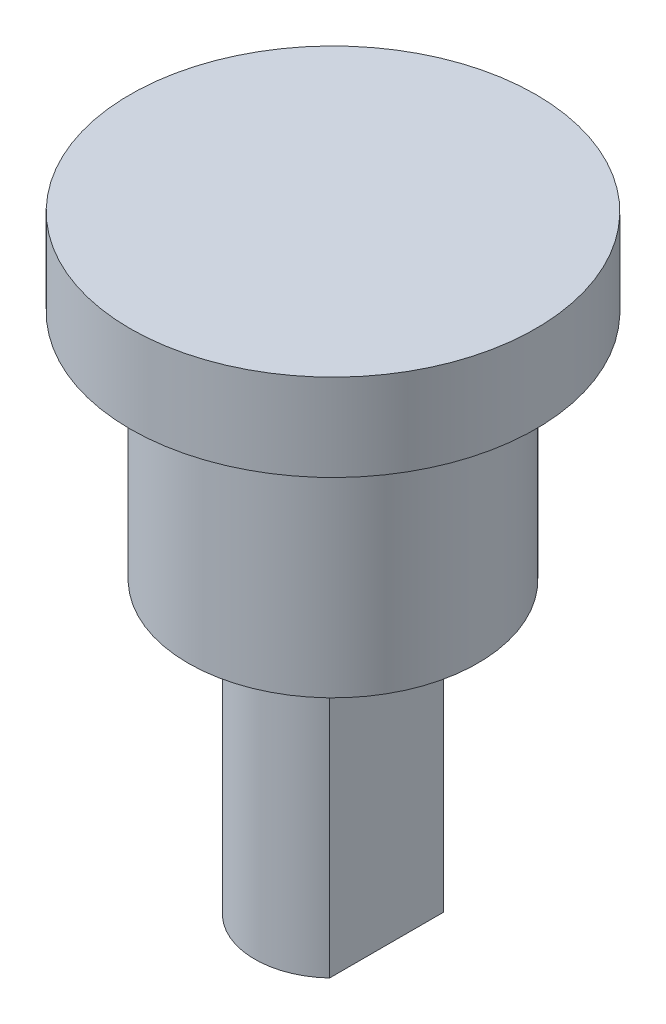
ISO-10303-21;
HEADER;
FILE_DESCRIPTION(('STEP AP214'),'2;1');
FILE_NAME('part.step','',(''),(''),'','','');
FILE_SCHEMA(('AUTOMOTIVE_DESIGN { 1 0 10303 214 1 1 1 1 }'));
ENDSEC;
DATA;
#1=APPLICATION_CONTEXT('core data for automotive mechanical design processes');
#2=APPLICATION_PROTOCOL_DEFINITION('international standard','automotive_design',2000,#1);
#3=PRODUCT_CONTEXT('',#1,'mechanical');
#4=PRODUCT('Part','Part','',(#3));
#5=PRODUCT_RELATED_PRODUCT_CATEGORY('part','',(#4));
#6=PRODUCT_DEFINITION_FORMATION('','',#4);
#7=PRODUCT_DEFINITION_CONTEXT('part definition',#1,'design');
#8=PRODUCT_DEFINITION('design','',#6,#7);
#9=PRODUCT_DEFINITION_SHAPE('','',#8);
#10=(LENGTH_UNIT() NAMED_UNIT(*) SI_UNIT(.MILLI.,.METRE.));
#11=(NAMED_UNIT(*) PLANE_ANGLE_UNIT() SI_UNIT($,.RADIAN.));
#12=(NAMED_UNIT(*) SI_UNIT($,.STERADIAN.) SOLID_ANGLE_UNIT());
#13=UNCERTAINTY_MEASURE_WITH_UNIT(LENGTH_MEASURE(1.E-05),#10,'distance_accuracy_value','');
#14=(GEOMETRIC_REPRESENTATION_CONTEXT(3) GLOBAL_UNCERTAINTY_ASSIGNED_CONTEXT((#13)) GLOBAL_UNIT_ASSIGNED_CONTEXT((#10,
#11,#12)) REPRESENTATION_CONTEXT('',''));
#15=CARTESIAN_POINT('',(0.,0.,0.));
#16=DIRECTION('',(0.,0.,1.));
#17=DIRECTION('',(1.,0.,0.));
#18=AXIS2_PLACEMENT_3D('',#15,#16,#17);
#19=CARTESIAN_POINT('',(0.,3.,0.));
#20=DIRECTION('',(0.,-1.,0.));
#21=DIRECTION('',(0.,0.,-1.));
#22=AXIS2_PLACEMENT_3D('',#19,#20,#21);
#23=CYLINDRICAL_SURFACE('',#22,7.);
#24=CARTESIAN_POINT('',(0.,3.,0.));
#25=DIRECTION('',(0.,1.,0.));
#26=DIRECTION('',(0.,0.,1.));
#27=AXIS2_PLACEMENT_3D('',#24,#25,#26);
#28=CIRCLE('',#27,7.);
#29=CARTESIAN_POINT('',(0.,3.,7.));
#30=VERTEX_POINT('',#29);
#31=EDGE_CURVE('E12',#30,#30,#28,.T.);
#32=ORIENTED_EDGE('',*,*,#31,.F.);
#33=EDGE_LOOP('',(#32));
#34=FACE_BOUND('',#33,.T.);
#35=CARTESIAN_POINT('',(0.,0.,0.));
#36=DIRECTION('',(0.,1.,0.));
#37=DIRECTION('',(0.,0.,1.));
#38=AXIS2_PLACEMENT_3D('',#35,#36,#37);
#39=CIRCLE('',#38,7.);
#40=CARTESIAN_POINT('',(0.,0.,7.));
#41=VERTEX_POINT('',#40);
#42=EDGE_CURVE('E62',#41,#41,#39,.T.);
#43=ORIENTED_EDGE('',*,*,#42,.T.);
#44=EDGE_LOOP('',(#43));
#45=FACE_BOUND('',#44,.T.);
#46=ADVANCED_FACE('F59',(#34,#45),#23,.T.);
#47=CARTESIAN_POINT('',(0.,0.,0.));
#48=DIRECTION('',(0.,1.,0.));
#49=DIRECTION('',(0.,0.,1.));
#50=AXIS2_PLACEMENT_3D('',#47,#48,#49);
#51=PLANE('',#50);
#52=CARTESIAN_POINT('',(0.,0.,0.));
#53=DIRECTION('',(0.,1.,0.));
#54=DIRECTION('',(0.,0.,1.));
#55=AXIS2_PLACEMENT_3D('',#52,#53,#54);
#56=CIRCLE('',#55,5.);
#57=CARTESIAN_POINT('',(0.,0.,5.));
#58=VERTEX_POINT('',#57);
#59=EDGE_CURVE('E144',#58,#58,#56,.T.);
#60=ORIENTED_EDGE('',*,*,#59,.T.);
#61=EDGE_LOOP('',(#60));
#62=FACE_BOUND('',#61,.T.);
#63=ORIENTED_EDGE('',*,*,#42,.F.);
#64=EDGE_LOOP('',(#63));
#65=FACE_BOUND('',#64,.T.);
#66=ADVANCED_FACE('F157',(#62,#65),#51,.F.);
#67=CARTESIAN_POINT('',(0.,3.,0.));
#68=DIRECTION('',(0.,1.,0.));
#69=DIRECTION('',(0.,0.,1.));
#70=AXIS2_PLACEMENT_3D('',#67,#68,#69);
#71=PLANE('',#70);
#72=ORIENTED_EDGE('',*,*,#31,.T.);
#73=EDGE_LOOP('',(#72));
#74=FACE_BOUND('',#73,.T.);
#75=ADVANCED_FACE('F163',(#74),#71,.T.);
#76=CARTESIAN_POINT('',(0.,-8.,0.));
#77=DIRECTION('',(0.,1.,0.));
#78=DIRECTION('',(0.,0.,1.));
#79=AXIS2_PLACEMENT_3D('',#76,#77,#78);
#80=CYLINDRICAL_SURFACE('',#79,5.);
#81=CARTESIAN_POINT('',(0.,-8.,0.));
#82=DIRECTION('',(0.,1.,0.));
#83=DIRECTION('',(0.,0.,1.));
#84=AXIS2_PLACEMENT_3D('',#81,#82,#83);
#85=CIRCLE('',#84,5.);
#86=CARTESIAN_POINT('',(0.,-8.,5.));
#87=VERTEX_POINT('',#86);
#88=EDGE_CURVE('E149',#87,#87,#85,.T.);
#89=ORIENTED_EDGE('',*,*,#88,.T.);
#90=EDGE_LOOP('',(#89));
#91=FACE_BOUND('',#90,.T.);
#92=ORIENTED_EDGE('',*,*,#59,.F.);
#93=EDGE_LOOP('',(#92));
#94=FACE_BOUND('',#93,.T.);
#95=ADVANCED_FACE('F160',(#91,#94),#80,.T.);
#96=CARTESIAN_POINT('',(0.,-8.,0.));
#97=DIRECTION('',(0.,1.,0.));
#98=DIRECTION('',(0.,0.,1.));
#99=AXIS2_PLACEMENT_3D('',#96,#97,#98);
#100=PLANE('',#99);
#101=DIRECTION('',(0.,0.,1.));
#102=VECTOR('',#101,1.);
#103=CARTESIAN_POINT('',(-1.85,-8.,0.));
#104=LINE('',#103,#102);
#105=CARTESIAN_POINT('',(-1.85,-8.,-1.96659604392971));
#106=VERTEX_POINT('',#105);
#107=CARTESIAN_POINT('',(-1.85,-8.,1.96659604392971));
#108=VERTEX_POINT('',#107);
#109=EDGE_CURVE('E138',#106,#108,#104,.T.);
#110=ORIENTED_EDGE('',*,*,#109,.T.);
#111=CARTESIAN_POINT('',(0.,-8.,0.));
#112=DIRECTION('',(0.,1.,0.));
#113=DIRECTION('',(0.,0.,1.));
#114=AXIS2_PLACEMENT_3D('',#111,#112,#113);
#115=CIRCLE('',#114,2.7);
#116=CARTESIAN_POINT('',(1.85,-8.,1.96659604392971));
#117=VERTEX_POINT('',#116);
#118=EDGE_CURVE('E74',#108,#117,#115,.T.);
#119=ORIENTED_EDGE('',*,*,#118,.T.);
#120=DIRECTION('',(0.,0.,1.));
#121=VECTOR('',#120,1.);
#122=CARTESIAN_POINT('',(1.85,-8.,0.));
#123=LINE('',#122,#121);
#124=CARTESIAN_POINT('',(1.85,-8.,-1.96659604392971));
#125=VERTEX_POINT('',#124);
#126=EDGE_CURVE('E133',#125,#117,#123,.T.);
#127=ORIENTED_EDGE('',*,*,#126,.F.);
#128=CARTESIAN_POINT('',(0.,-8.,0.));
#129=DIRECTION('',(0.,1.,0.));
#130=DIRECTION('',(0.,0.,1.));
#131=AXIS2_PLACEMENT_3D('',#128,#129,#130);
#132=CIRCLE('',#131,2.7);
#133=EDGE_CURVE('E111',#125,#106,#132,.T.);
#134=ORIENTED_EDGE('',*,*,#133,.T.);
#135=EDGE_LOOP('',(#110,#119,#127,#134));
#136=FACE_BOUND('',#135,.T.);
#137=ORIENTED_EDGE('',*,*,#88,.F.);
#138=EDGE_LOOP('',(#137));
#139=FACE_BOUND('',#138,.T.);
#140=ADVANCED_FACE('F162',(#136,#139),#100,.F.);
#141=CARTESIAN_POINT('',(0.,-18.,0.));
#142=DIRECTION('',(0.,1.,0.));
#143=DIRECTION('',(0.,0.,1.));
#144=AXIS2_PLACEMENT_3D('',#141,#142,#143);
#145=CYLINDRICAL_SURFACE('',#144,2.7);
#146=ORIENTED_EDGE('',*,*,#118,.F.);
#147=DIRECTION('',(0.,1.,0.));
#148=VECTOR('',#147,1.);
#149=CARTESIAN_POINT('',(-1.85,-18.,1.96659604392971));
#150=LINE('',#149,#148);
#151=CARTESIAN_POINT('',(-1.85,-18.,1.96659604392971));
#152=VERTEX_POINT('',#151);
#153=EDGE_CURVE('E79',#152,#108,#150,.T.);
#154=ORIENTED_EDGE('',*,*,#153,.F.);
#155=CARTESIAN_POINT('',(0.,-18.,0.));
#156=DIRECTION('',(0.,1.,0.));
#157=DIRECTION('',(0.,0.,1.));
#158=AXIS2_PLACEMENT_3D('',#155,#156,#157);
#159=CIRCLE('',#158,2.7);
#160=CARTESIAN_POINT('',(1.85,-18.,1.96659604392971));
#161=VERTEX_POINT('',#160);
#162=EDGE_CURVE('E120',#152,#161,#159,.T.);
#163=ORIENTED_EDGE('',*,*,#162,.T.);
#164=DIRECTION('',(0.,1.,0.));
#165=VECTOR('',#164,1.);
#166=CARTESIAN_POINT('',(1.85,-18.,1.96659604392971));
#167=LINE('',#166,#165);
#168=EDGE_CURVE('E116',#161,#117,#167,.T.);
#169=ORIENTED_EDGE('',*,*,#168,.T.);
#170=EDGE_LOOP('',(#146,#154,#163,#169));
#171=FACE_BOUND('',#170,.T.);
#172=ADVANCED_FACE('F170',(#171),#145,.T.);
#173=CARTESIAN_POINT('',(-1.85,-18.,0.));
#174=DIRECTION('',(-1.,0.,0.));
#175=DIRECTION('',(0.,0.,1.));
#176=AXIS2_PLACEMENT_3D('',#173,#174,#175);
#177=PLANE('',#176);
#178=ORIENTED_EDGE('',*,*,#109,.F.);
#179=DIRECTION('',(0.,1.,0.));
#180=VECTOR('',#179,1.);
#181=CARTESIAN_POINT('',(-1.85,-18.,-1.96659604392971));
#182=LINE('',#181,#180);
#183=CARTESIAN_POINT('',(-1.85,-18.,-1.96659604392971));
#184=VERTEX_POINT('',#183);
#185=EDGE_CURVE('E96',#184,#106,#182,.T.);
#186=ORIENTED_EDGE('',*,*,#185,.F.);
#187=DIRECTION('',(0.,0.,1.));
#188=VECTOR('',#187,1.);
#189=CARTESIAN_POINT('',(-1.85,-18.,0.));
#190=LINE('',#189,#188);
#191=EDGE_CURVE('E124',#184,#152,#190,.T.);
#192=ORIENTED_EDGE('',*,*,#191,.T.);
#193=ORIENTED_EDGE('',*,*,#153,.T.);
#194=EDGE_LOOP('',(#178,#186,#192,#193));
#195=FACE_BOUND('',#194,.T.);
#196=ADVANCED_FACE('F219',(#195),#177,.T.);
#197=CARTESIAN_POINT('',(0.,-18.,0.));
#198=DIRECTION('',(0.,1.,0.));
#199=DIRECTION('',(0.,0.,1.));
#200=AXIS2_PLACEMENT_3D('',#197,#198,#199);
#201=CYLINDRICAL_SURFACE('',#200,2.7);
#202=ORIENTED_EDGE('',*,*,#133,.F.);
#203=DIRECTION('',(0.,1.,0.));
#204=VECTOR('',#203,1.);
#205=CARTESIAN_POINT('',(1.85,-18.,-1.96659604392971));
#206=LINE('',#205,#204);
#207=CARTESIAN_POINT('',(1.85,-18.,-1.96659604392971));
#208=VERTEX_POINT('',#207);
#209=EDGE_CURVE('E106',#208,#125,#206,.T.);
#210=ORIENTED_EDGE('',*,*,#209,.F.);
#211=CARTESIAN_POINT('',(0.,-18.,0.));
#212=DIRECTION('',(0.,1.,0.));
#213=DIRECTION('',(0.,0.,1.));
#214=AXIS2_PLACEMENT_3D('',#211,#212,#213);
#215=CIRCLE('',#214,2.7);
#216=EDGE_CURVE('E108',#208,#184,#215,.T.);
#217=ORIENTED_EDGE('',*,*,#216,.T.);
#218=ORIENTED_EDGE('',*,*,#185,.T.);
#219=EDGE_LOOP('',(#202,#210,#217,#218));
#220=FACE_BOUND('',#219,.T.);
#221=ADVANCED_FACE('F107',(#220),#201,.T.);
#222=CARTESIAN_POINT('',(1.85,-18.,0.));
#223=DIRECTION('',(-1.,0.,0.));
#224=DIRECTION('',(0.,0.,1.));
#225=AXIS2_PLACEMENT_3D('',#222,#223,#224);
#226=PLANE('',#225);
#227=ORIENTED_EDGE('',*,*,#126,.T.);
#228=ORIENTED_EDGE('',*,*,#168,.F.);
#229=DIRECTION('',(0.,0.,1.));
#230=VECTOR('',#229,1.);
#231=CARTESIAN_POINT('',(1.85,-18.,0.));
#232=LINE('',#231,#230);
#233=EDGE_CURVE('E103',#208,#161,#232,.T.);
#234=ORIENTED_EDGE('',*,*,#233,.F.);
#235=ORIENTED_EDGE('',*,*,#209,.T.);
#236=EDGE_LOOP('',(#227,#228,#234,#235));
#237=FACE_BOUND('',#236,.T.);
#238=ADVANCED_FACE('F118',(#237),#226,.F.);
#239=CARTESIAN_POINT('',(0.,-18.,0.));
#240=DIRECTION('',(0.,1.,0.));
#241=DIRECTION('',(0.,0.,1.));
#242=AXIS2_PLACEMENT_3D('',#239,#240,#241);
#243=PLANE('',#242);
#244=ORIENTED_EDGE('',*,*,#162,.F.);
#245=ORIENTED_EDGE('',*,*,#191,.F.);
#246=ORIENTED_EDGE('',*,*,#216,.F.);
#247=ORIENTED_EDGE('',*,*,#233,.T.);
#248=EDGE_LOOP('',(#244,#245,#246,#247));
#249=FACE_BOUND('',#248,.T.);
#250=ADVANCED_FACE('F122',(#249),#243,.F.);
#251=CLOSED_SHELL('',(#46,#66,#75,#95,#140,#172,#196,#221,#238,#250));
#252=MANIFOLD_SOLID_BREP('B2',#251);
#253=ADVANCED_BREP_SHAPE_REPRESENTATION('',(#18,#252),#14);
#254=SHAPE_DEFINITION_REPRESENTATION(#9,#253);
ENDSEC;
END-ISO-10303-21;
